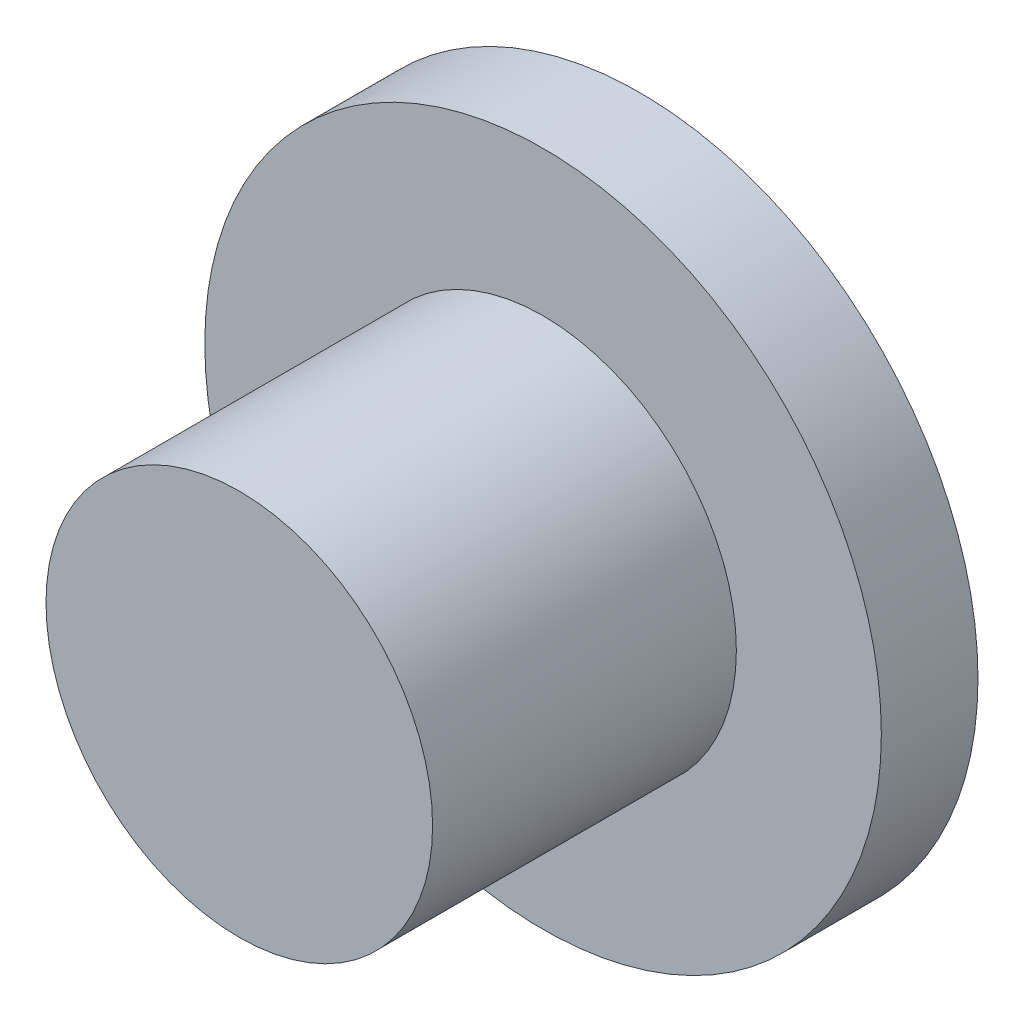
ISO-10303-21;
HEADER;
FILE_DESCRIPTION(('STEP AP214'),'2;1');
FILE_NAME('part.step','',(''),(''),'','','');
FILE_SCHEMA(('AUTOMOTIVE_DESIGN { 1 0 10303 214 1 1 1 1 }'));
ENDSEC;
DATA;
#1=APPLICATION_CONTEXT('core data for automotive mechanical design processes');
#2=APPLICATION_PROTOCOL_DEFINITION('international standard','automotive_design',2000,#1);
#3=PRODUCT_CONTEXT('',#1,'mechanical');
#4=PRODUCT('Part','Part','',(#3));
#5=PRODUCT_RELATED_PRODUCT_CATEGORY('part','',(#4));
#6=PRODUCT_DEFINITION_FORMATION('','',#4);
#7=PRODUCT_DEFINITION_CONTEXT('part definition',#1,'design');
#8=PRODUCT_DEFINITION('design','',#6,#7);
#9=PRODUCT_DEFINITION_SHAPE('','',#8);
#10=(LENGTH_UNIT() NAMED_UNIT(*) SI_UNIT(.MILLI.,.METRE.));
#11=(NAMED_UNIT(*) PLANE_ANGLE_UNIT() SI_UNIT($,.RADIAN.));
#12=(NAMED_UNIT(*) SI_UNIT($,.STERADIAN.) SOLID_ANGLE_UNIT());
#13=UNCERTAINTY_MEASURE_WITH_UNIT(LENGTH_MEASURE(1.E-05),#10,'distance_accuracy_value','');
#14=(GEOMETRIC_REPRESENTATION_CONTEXT(3) GLOBAL_UNCERTAINTY_ASSIGNED_CONTEXT((#13)) GLOBAL_UNIT_ASSIGNED_CONTEXT((#10,
#11,#12)) REPRESENTATION_CONTEXT('',''));
#15=CARTESIAN_POINT('',(0.,0.,0.));
#16=DIRECTION('',(0.,0.,1.));
#17=DIRECTION('',(1.,0.,0.));
#18=AXIS2_PLACEMENT_3D('',#15,#16,#17);
#19=CARTESIAN_POINT('',(0.,0.,0.7));
#20=DIRECTION('',(0.,0.,-1.));
#21=DIRECTION('',(-1.,0.,0.));
#22=AXIS2_PLACEMENT_3D('',#19,#20,#21);
#23=CYLINDRICAL_SURFACE('',#22,2.45);
#24=CARTESIAN_POINT('',(0.,0.,0.7));
#25=DIRECTION('',(0.,0.,1.));
#26=DIRECTION('',(1.,0.,0.));
#27=AXIS2_PLACEMENT_3D('',#24,#25,#26);
#28=CIRCLE('',#27,2.45);
#29=CARTESIAN_POINT('',(2.45,0.,0.7));
#30=VERTEX_POINT('',#29);
#31=EDGE_CURVE('E10',#30,#30,#28,.T.);
#32=ORIENTED_EDGE('',*,*,#31,.F.);
#33=EDGE_LOOP('',(#32));
#34=FACE_BOUND('',#33,.T.);
#35=CARTESIAN_POINT('',(0.,0.,0.));
#36=DIRECTION('',(0.,0.,1.));
#37=DIRECTION('',(1.,0.,0.));
#38=AXIS2_PLACEMENT_3D('',#35,#36,#37);
#39=CIRCLE('',#38,2.45);
#40=CARTESIAN_POINT('',(2.45,0.,0.));
#41=VERTEX_POINT('',#40);
#42=EDGE_CURVE('E40',#41,#41,#39,.T.);
#43=ORIENTED_EDGE('',*,*,#42,.T.);
#44=EDGE_LOOP('',(#43));
#45=FACE_BOUND('',#44,.T.);
#46=ADVANCED_FACE('F37',(#34,#45),#23,.T.);
#47=CARTESIAN_POINT('',(0.,0.,0.7));
#48=DIRECTION('',(0.,0.,1.));
#49=DIRECTION('',(1.,0.,0.));
#50=AXIS2_PLACEMENT_3D('',#47,#48,#49);
#51=PLANE('',#50);
#52=CARTESIAN_POINT('',(0.,0.,0.7));
#53=DIRECTION('',(0.,0.,1.));
#54=DIRECTION('',(1.,0.,0.));
#55=AXIS2_PLACEMENT_3D('',#52,#53,#54);
#56=CIRCLE('',#55,1.4);
#57=CARTESIAN_POINT('',(1.4,0.,0.7));
#58=VERTEX_POINT('',#57);
#59=EDGE_CURVE('E47',#58,#58,#56,.F.);
#60=ORIENTED_EDGE('',*,*,#59,.T.);
#61=EDGE_LOOP('',(#60));
#62=FACE_BOUND('',#61,.T.);
#63=ORIENTED_EDGE('',*,*,#31,.T.);
#64=EDGE_LOOP('',(#63));
#65=FACE_BOUND('',#64,.T.);
#66=ADVANCED_FACE('F67',(#62,#65),#51,.T.);
#67=CARTESIAN_POINT('',(0.,0.,0.));
#68=DIRECTION('',(0.,0.,1.));
#69=DIRECTION('',(1.,0.,0.));
#70=AXIS2_PLACEMENT_3D('',#67,#68,#69);
#71=PLANE('',#70);
#72=ORIENTED_EDGE('',*,*,#42,.F.);
#73=EDGE_LOOP('',(#72));
#74=FACE_BOUND('',#73,.T.);
#75=ADVANCED_FACE('F59',(#74),#71,.F.);
#76=CARTESIAN_POINT('',(0.,0.,2.9));
#77=DIRECTION('',(0.,0.,-1.));
#78=DIRECTION('',(-1.,0.,0.));
#79=AXIS2_PLACEMENT_3D('',#76,#77,#78);
#80=CYLINDRICAL_SURFACE('',#79,1.4);
#81=ORIENTED_EDGE('',*,*,#59,.F.);
#82=EDGE_LOOP('',(#81));
#83=FACE_BOUND('',#82,.T.);
#84=CARTESIAN_POINT('',(0.,0.,2.9));
#85=DIRECTION('',(0.,0.,1.));
#86=DIRECTION('',(1.,0.,0.));
#87=AXIS2_PLACEMENT_3D('',#84,#85,#86);
#88=CIRCLE('',#87,1.4);
#89=CARTESIAN_POINT('',(1.4,0.,2.9));
#90=VERTEX_POINT('',#89);
#91=EDGE_CURVE('E51',#90,#90,#88,.T.);
#92=ORIENTED_EDGE('',*,*,#91,.F.);
#93=EDGE_LOOP('',(#92));
#94=FACE_BOUND('',#93,.T.);
#95=ADVANCED_FACE('F57',(#83,#94),#80,.T.);
#96=CARTESIAN_POINT('',(0.,0.,2.9));
#97=DIRECTION('',(0.,0.,1.));
#98=DIRECTION('',(1.,0.,0.));
#99=AXIS2_PLACEMENT_3D('',#96,#97,#98);
#100=PLANE('',#99);
#101=ORIENTED_EDGE('',*,*,#91,.T.);
#102=EDGE_LOOP('',(#101));
#103=FACE_BOUND('',#102,.T.);
#104=ADVANCED_FACE('F55',(#103),#100,.T.);
#105=CLOSED_SHELL('',(#46,#66,#75,#95,#104));
#106=MANIFOLD_SOLID_BREP('B2',#105);
#107=ADVANCED_BREP_SHAPE_REPRESENTATION('',(#18,#106),#14);
#108=SHAPE_DEFINITION_REPRESENTATION(#9,#107);
ENDSEC;
END-ISO-10303-21;
